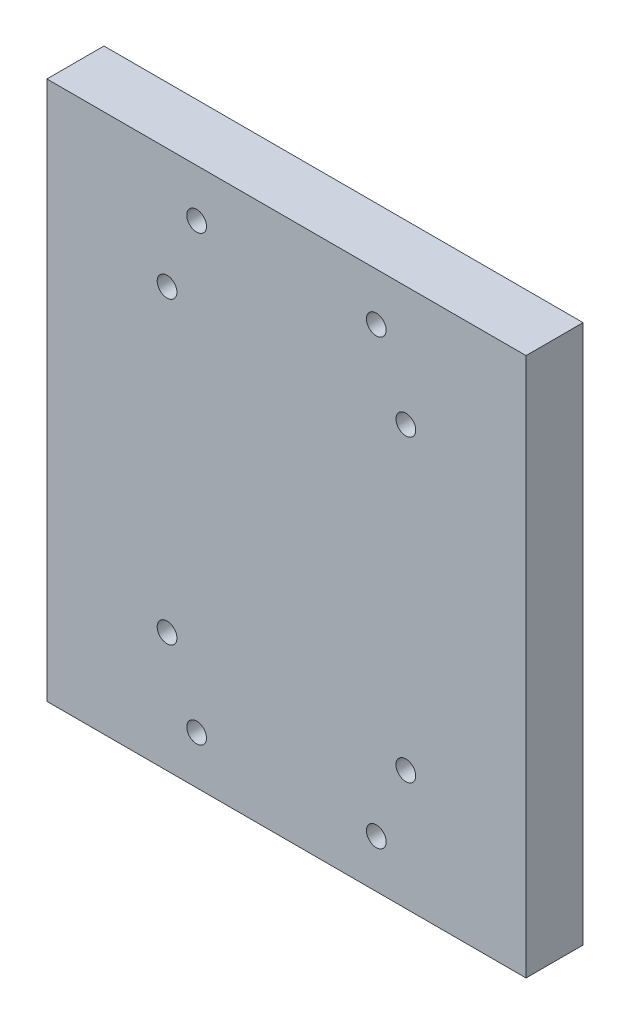
ISO-10303-21;
HEADER;
FILE_DESCRIPTION(('STEP AP214'),'2;1');
FILE_NAME('part.step','',(''),(''),'','','');
FILE_SCHEMA(('AUTOMOTIVE_DESIGN { 1 0 10303 214 1 1 1 1 }'));
ENDSEC;
DATA;
#1=APPLICATION_CONTEXT('core data for automotive mechanical design processes');
#2=APPLICATION_PROTOCOL_DEFINITION('international standard','automotive_design',2000,#1);
#3=PRODUCT_CONTEXT('',#1,'mechanical');
#4=PRODUCT('Part','Part','',(#3));
#5=PRODUCT_RELATED_PRODUCT_CATEGORY('part','',(#4));
#6=PRODUCT_DEFINITION_FORMATION('','',#4);
#7=PRODUCT_DEFINITION_CONTEXT('part definition',#1,'design');
#8=PRODUCT_DEFINITION('design','',#6,#7);
#9=PRODUCT_DEFINITION_SHAPE('','',#8);
#10=(LENGTH_UNIT() NAMED_UNIT(*) SI_UNIT(.MILLI.,.METRE.));
#11=(NAMED_UNIT(*) PLANE_ANGLE_UNIT() SI_UNIT($,.RADIAN.));
#12=(NAMED_UNIT(*) SI_UNIT($,.STERADIAN.) SOLID_ANGLE_UNIT());
#13=UNCERTAINTY_MEASURE_WITH_UNIT(LENGTH_MEASURE(1.E-05),#10,'distance_accuracy_value','');
#14=(GEOMETRIC_REPRESENTATION_CONTEXT(3) GLOBAL_UNCERTAINTY_ASSIGNED_CONTEXT((#13)) GLOBAL_UNIT_ASSIGNED_CONTEXT((#10,
#11,#12)) REPRESENTATION_CONTEXT('',''));
#15=CARTESIAN_POINT('',(0.,0.,0.));
#16=DIRECTION('',(0.,0.,1.));
#17=DIRECTION('',(1.,0.,0.));
#18=AXIS2_PLACEMENT_3D('',#15,#16,#17);
#19=CARTESIAN_POINT('',(0.,90.,9.53));
#20=DIRECTION('',(0.,0.,-1.));
#21=DIRECTION('',(-1.,0.,0.));
#22=AXIS2_PLACEMENT_3D('',#19,#20,#21);
#23=PLANE('',#22);
#24=CARTESIAN_POINT('',(20.065,70.,9.53));
#25=DIRECTION('',(0.,0.,1.));
#26=DIRECTION('',(1.,0.,0.));
#27=AXIS2_PLACEMENT_3D('',#24,#25,#26);
#28=CIRCLE('',#27,1.65);
#29=CARTESIAN_POINT('',(21.715,70.,9.53));
#30=VERTEX_POINT('',#29);
#31=EDGE_CURVE('E132',#30,#30,#28,.T.);
#32=ORIENTED_EDGE('',*,*,#31,.F.);
#33=EDGE_LOOP('',(#32));
#34=FACE_BOUND('',#33,.T.);
#35=CARTESIAN_POINT('',(20.065,20.,9.53));
#36=DIRECTION('',(0.,0.,1.));
#37=DIRECTION('',(1.,0.,0.));
#38=AXIS2_PLACEMENT_3D('',#35,#36,#37);
#39=CIRCLE('',#38,1.65);
#40=CARTESIAN_POINT('',(21.715,20.,9.53));
#41=VERTEX_POINT('',#40);
#42=EDGE_CURVE('E122',#41,#41,#39,.T.);
#43=ORIENTED_EDGE('',*,*,#42,.F.);
#44=EDGE_LOOP('',(#43));
#45=FACE_BOUND('',#44,.T.);
#46=CARTESIAN_POINT('',(59.935,20.,9.53));
#47=DIRECTION('',(0.,0.,1.));
#48=DIRECTION('',(1.,0.,0.));
#49=AXIS2_PLACEMENT_3D('',#46,#47,#48);
#50=CIRCLE('',#49,1.65);
#51=CARTESIAN_POINT('',(61.585,20.,9.53));
#52=VERTEX_POINT('',#51);
#53=EDGE_CURVE('E119',#52,#52,#50,.T.);
#54=ORIENTED_EDGE('',*,*,#53,.F.);
#55=EDGE_LOOP('',(#54));
#56=FACE_BOUND('',#55,.T.);
#57=CARTESIAN_POINT('',(59.935,70.,9.53));
#58=DIRECTION('',(0.,0.,1.));
#59=DIRECTION('',(1.,0.,0.));
#60=AXIS2_PLACEMENT_3D('',#57,#58,#59);
#61=CIRCLE('',#60,1.65);
#62=CARTESIAN_POINT('',(61.585,70.,9.53));
#63=VERTEX_POINT('',#62);
#64=EDGE_CURVE('E116',#63,#63,#61,.T.);
#65=ORIENTED_EDGE('',*,*,#64,.F.);
#66=EDGE_LOOP('',(#65));
#67=FACE_BOUND('',#66,.T.);
#68=CARTESIAN_POINT('',(55.,81.9999999999998,9.53));
#69=DIRECTION('',(0.,0.,1.));
#70=DIRECTION('',(1.,0.,0.));
#71=AXIS2_PLACEMENT_3D('',#68,#69,#70);
#72=CIRCLE('',#71,1.65);
#73=CARTESIAN_POINT('',(56.65,81.9999999999998,9.53));
#74=VERTEX_POINT('',#73);
#75=EDGE_CURVE('E143',#74,#74,#72,.T.);
#76=ORIENTED_EDGE('',*,*,#75,.F.);
#77=EDGE_LOOP('',(#76));
#78=FACE_BOUND('',#77,.T.);
#79=CARTESIAN_POINT('',(55.,8.,9.53));
#80=DIRECTION('',(0.,0.,1.));
#81=DIRECTION('',(1.,0.,0.));
#82=AXIS2_PLACEMENT_3D('',#79,#80,#81);
#83=CIRCLE('',#82,1.65);
#84=CARTESIAN_POINT('',(56.65,8.,9.53));
#85=VERTEX_POINT('',#84);
#86=EDGE_CURVE('E106',#85,#85,#83,.T.);
#87=ORIENTED_EDGE('',*,*,#86,.F.);
#88=EDGE_LOOP('',(#87));
#89=FACE_BOUND('',#88,.T.);
#90=DIRECTION('',(0.,-1.,0.));
#91=VECTOR('',#90,1.);
#92=CARTESIAN_POINT('',(0.,0.,9.53));
#93=LINE('',#92,#91);
#94=CARTESIAN_POINT('',(0.,90.,9.53));
#95=VERTEX_POINT('',#94);
#96=CARTESIAN_POINT('',(0.,0.,9.53));
#97=VERTEX_POINT('',#96);
#98=EDGE_CURVE('E90',#95,#97,#93,.T.);
#99=ORIENTED_EDGE('',*,*,#98,.T.);
#100=DIRECTION('',(1.,0.,0.));
#101=VECTOR('',#100,1.);
#102=CARTESIAN_POINT('',(0.,0.,9.53));
#103=LINE('',#102,#101);
#104=CARTESIAN_POINT('',(80.,0.,9.53));
#105=VERTEX_POINT('',#104);
#106=EDGE_CURVE('E85',#97,#105,#103,.T.);
#107=ORIENTED_EDGE('',*,*,#106,.T.);
#108=DIRECTION('',(0.,1.,0.));
#109=VECTOR('',#108,1.);
#110=CARTESIAN_POINT('',(80.,0.,9.53));
#111=LINE('',#110,#109);
#112=CARTESIAN_POINT('',(80.,90.,9.53));
#113=VERTEX_POINT('',#112);
#114=EDGE_CURVE('E88',#105,#113,#111,.T.);
#115=ORIENTED_EDGE('',*,*,#114,.T.);
#116=DIRECTION('',(-1.,0.,0.));
#117=VECTOR('',#116,1.);
#118=CARTESIAN_POINT('',(0.,90.,9.53));
#119=LINE('',#118,#117);
#120=EDGE_CURVE('E55',#113,#95,#119,.T.);
#121=ORIENTED_EDGE('',*,*,#120,.T.);
#122=EDGE_LOOP('',(#99,#107,#115,#121));
#123=FACE_BOUND('',#122,.T.);
#124=CARTESIAN_POINT('',(25.,8.,9.53));
#125=DIRECTION('',(0.,0.,1.));
#126=DIRECTION('',(1.,0.,0.));
#127=AXIS2_PLACEMENT_3D('',#124,#125,#126);
#128=CIRCLE('',#127,1.65);
#129=CARTESIAN_POINT('',(26.65,8.,9.53));
#130=VERTEX_POINT('',#129);
#131=EDGE_CURVE('E149',#130,#130,#128,.T.);
#132=ORIENTED_EDGE('',*,*,#131,.F.);
#133=EDGE_LOOP('',(#132));
#134=FACE_BOUND('',#133,.T.);
#135=CARTESIAN_POINT('',(25.,81.9999999999998,9.53));
#136=DIRECTION('',(0.,0.,1.));
#137=DIRECTION('',(1.,0.,0.));
#138=AXIS2_PLACEMENT_3D('',#135,#136,#137);
#139=CIRCLE('',#138,1.65);
#140=CARTESIAN_POINT('',(26.65,81.9999999999998,9.53));
#141=VERTEX_POINT('',#140);
#142=EDGE_CURVE('E137',#141,#141,#139,.T.);
#143=ORIENTED_EDGE('',*,*,#142,.F.);
#144=EDGE_LOOP('',(#143));
#145=FACE_BOUND('',#144,.T.);
#146=ADVANCED_FACE('F36',(#34,#45,#56,#67,#78,#89,#123,#134,#145),#23,.F.);
#147=CARTESIAN_POINT('',(0.,90.,0.));
#148=DIRECTION('',(0.,0.,-1.));
#149=DIRECTION('',(-1.,0.,0.));
#150=AXIS2_PLACEMENT_3D('',#147,#148,#149);
#151=PLANE('',#150);
#152=CARTESIAN_POINT('',(20.065,70.,0.));
#153=DIRECTION('',(0.,0.,-1.));
#154=DIRECTION('',(-1.,0.,0.));
#155=AXIS2_PLACEMENT_3D('',#152,#153,#154);
#156=CIRCLE('',#155,1.65);
#157=CARTESIAN_POINT('',(18.415,70.,0.));
#158=VERTEX_POINT('',#157);
#159=EDGE_CURVE('E40',#158,#158,#156,.T.);
#160=ORIENTED_EDGE('',*,*,#159,.F.);
#161=EDGE_LOOP('',(#160));
#162=FACE_BOUND('',#161,.T.);
#163=CARTESIAN_POINT('',(20.065,20.,0.));
#164=DIRECTION('',(0.,0.,-1.));
#165=DIRECTION('',(-1.,0.,0.));
#166=AXIS2_PLACEMENT_3D('',#163,#164,#165);
#167=CIRCLE('',#166,1.65);
#168=CARTESIAN_POINT('',(18.415,20.,0.));
#169=VERTEX_POINT('',#168);
#170=EDGE_CURVE('E120',#169,#169,#167,.T.);
#171=ORIENTED_EDGE('',*,*,#170,.F.);
#172=EDGE_LOOP('',(#171));
#173=FACE_BOUND('',#172,.T.);
#174=CARTESIAN_POINT('',(59.935,20.,0.));
#175=DIRECTION('',(0.,0.,-1.));
#176=DIRECTION('',(-1.,0.,0.));
#177=AXIS2_PLACEMENT_3D('',#174,#175,#176);
#178=CIRCLE('',#177,1.65);
#179=CARTESIAN_POINT('',(58.285,20.,0.));
#180=VERTEX_POINT('',#179);
#181=EDGE_CURVE('E117',#180,#180,#178,.T.);
#182=ORIENTED_EDGE('',*,*,#181,.F.);
#183=EDGE_LOOP('',(#182));
#184=FACE_BOUND('',#183,.T.);
#185=CARTESIAN_POINT('',(59.935,70.,0.));
#186=DIRECTION('',(0.,0.,-1.));
#187=DIRECTION('',(-1.,0.,0.));
#188=AXIS2_PLACEMENT_3D('',#185,#186,#187);
#189=CIRCLE('',#188,1.65);
#190=CARTESIAN_POINT('',(58.285,70.,0.));
#191=VERTEX_POINT('',#190);
#192=EDGE_CURVE('E112',#191,#191,#189,.T.);
#193=ORIENTED_EDGE('',*,*,#192,.F.);
#194=EDGE_LOOP('',(#193));
#195=FACE_BOUND('',#194,.T.);
#196=CARTESIAN_POINT('',(55.,81.9999999999998,0.));
#197=DIRECTION('',(0.,0.,1.));
#198=DIRECTION('',(1.,0.,0.));
#199=AXIS2_PLACEMENT_3D('',#196,#197,#198);
#200=CIRCLE('',#199,1.65);
#201=CARTESIAN_POINT('',(56.65,81.9999999999998,0.));
#202=VERTEX_POINT('',#201);
#203=EDGE_CURVE('E140',#202,#202,#200,.T.);
#204=ORIENTED_EDGE('',*,*,#203,.T.);
#205=EDGE_LOOP('',(#204));
#206=FACE_BOUND('',#205,.T.);
#207=CARTESIAN_POINT('',(55.,8.,0.));
#208=DIRECTION('',(0.,0.,1.));
#209=DIRECTION('',(1.,0.,0.));
#210=AXIS2_PLACEMENT_3D('',#207,#208,#209);
#211=CIRCLE('',#210,1.65);
#212=CARTESIAN_POINT('',(56.65,8.,0.));
#213=VERTEX_POINT('',#212);
#214=EDGE_CURVE('E152',#213,#213,#211,.T.);
#215=ORIENTED_EDGE('',*,*,#214,.T.);
#216=EDGE_LOOP('',(#215));
#217=FACE_BOUND('',#216,.T.);
#218=DIRECTION('',(0.,-1.,0.));
#219=VECTOR('',#218,1.);
#220=CARTESIAN_POINT('',(0.,0.,0.));
#221=LINE('',#220,#219);
#222=CARTESIAN_POINT('',(0.,90.,0.));
#223=VERTEX_POINT('',#222);
#224=CARTESIAN_POINT('',(0.,0.,0.));
#225=VERTEX_POINT('',#224);
#226=EDGE_CURVE('E103',#223,#225,#221,.T.);
#227=ORIENTED_EDGE('',*,*,#226,.F.);
#228=DIRECTION('',(-1.,0.,0.));
#229=VECTOR('',#228,1.);
#230=CARTESIAN_POINT('',(0.,90.,0.));
#231=LINE('',#230,#229);
#232=CARTESIAN_POINT('',(80.,90.,0.));
#233=VERTEX_POINT('',#232);
#234=EDGE_CURVE('E78',#233,#223,#231,.T.);
#235=ORIENTED_EDGE('',*,*,#234,.F.);
#236=DIRECTION('',(0.,1.,0.));
#237=VECTOR('',#236,1.);
#238=CARTESIAN_POINT('',(80.,0.,0.));
#239=LINE('',#238,#237);
#240=CARTESIAN_POINT('',(80.,0.,0.));
#241=VERTEX_POINT('',#240);
#242=EDGE_CURVE('E72',#241,#233,#239,.T.);
#243=ORIENTED_EDGE('',*,*,#242,.F.);
#244=DIRECTION('',(1.,0.,0.));
#245=VECTOR('',#244,1.);
#246=CARTESIAN_POINT('',(0.,0.,0.));
#247=LINE('',#246,#245);
#248=EDGE_CURVE('E94',#225,#241,#247,.T.);
#249=ORIENTED_EDGE('',*,*,#248,.F.);
#250=EDGE_LOOP('',(#227,#235,#243,#249));
#251=FACE_BOUND('',#250,.T.);
#252=CARTESIAN_POINT('',(25.,8.,0.));
#253=DIRECTION('',(0.,0.,1.));
#254=DIRECTION('',(1.,0.,0.));
#255=AXIS2_PLACEMENT_3D('',#252,#253,#254);
#256=CIRCLE('',#255,1.65);
#257=CARTESIAN_POINT('',(26.65,8.,0.));
#258=VERTEX_POINT('',#257);
#259=EDGE_CURVE('E146',#258,#258,#256,.T.);
#260=ORIENTED_EDGE('',*,*,#259,.T.);
#261=EDGE_LOOP('',(#260));
#262=FACE_BOUND('',#261,.T.);
#263=CARTESIAN_POINT('',(25.,81.9999999999998,0.));
#264=DIRECTION('',(0.,0.,1.));
#265=DIRECTION('',(1.,0.,0.));
#266=AXIS2_PLACEMENT_3D('',#263,#264,#265);
#267=CIRCLE('',#266,1.65);
#268=CARTESIAN_POINT('',(26.65,81.9999999999998,0.));
#269=VERTEX_POINT('',#268);
#270=EDGE_CURVE('E115',#269,#269,#267,.T.);
#271=ORIENTED_EDGE('',*,*,#270,.T.);
#272=EDGE_LOOP('',(#271));
#273=FACE_BOUND('',#272,.T.);
#274=ADVANCED_FACE('F160',(#162,#173,#184,#195,#206,#217,#251,#262,#273),#151,.T.);
#275=CARTESIAN_POINT('',(0.,0.,9.53));
#276=DIRECTION('',(1.,0.,0.));
#277=DIRECTION('',(0.,0.,-1.));
#278=AXIS2_PLACEMENT_3D('',#275,#276,#277);
#279=PLANE('',#278);
#280=ORIENTED_EDGE('',*,*,#226,.T.);
#281=DIRECTION('',(0.,0.,-1.));
#282=VECTOR('',#281,1.);
#283=CARTESIAN_POINT('',(0.,0.,9.53));
#284=LINE('',#283,#282);
#285=EDGE_CURVE('E11',#97,#225,#284,.T.);
#286=ORIENTED_EDGE('',*,*,#285,.F.);
#287=ORIENTED_EDGE('',*,*,#98,.F.);
#288=DIRECTION('',(0.,0.,-1.));
#289=VECTOR('',#288,1.);
#290=CARTESIAN_POINT('',(0.,90.,9.53));
#291=LINE('',#290,#289);
#292=EDGE_CURVE('E99',#95,#223,#291,.T.);
#293=ORIENTED_EDGE('',*,*,#292,.T.);
#294=EDGE_LOOP('',(#280,#286,#287,#293));
#295=FACE_BOUND('',#294,.T.);
#296=ADVANCED_FACE('F38',(#295),#279,.F.);
#297=CARTESIAN_POINT('',(0.,0.,9.53));
#298=DIRECTION('',(0.,1.,0.));
#299=DIRECTION('',(0.,0.,1.));
#300=AXIS2_PLACEMENT_3D('',#297,#298,#299);
#301=PLANE('',#300);
#302=ORIENTED_EDGE('',*,*,#248,.T.);
#303=DIRECTION('',(0.,0.,-1.));
#304=VECTOR('',#303,1.);
#305=CARTESIAN_POINT('',(80.,0.,9.53));
#306=LINE('',#305,#304);
#307=EDGE_CURVE('E46',#105,#241,#306,.T.);
#308=ORIENTED_EDGE('',*,*,#307,.F.);
#309=ORIENTED_EDGE('',*,*,#106,.F.);
#310=ORIENTED_EDGE('',*,*,#285,.T.);
#311=EDGE_LOOP('',(#302,#308,#309,#310));
#312=FACE_BOUND('',#311,.T.);
#313=ADVANCED_FACE('F93',(#312),#301,.F.);
#314=CARTESIAN_POINT('',(80.,0.,9.53));
#315=DIRECTION('',(-1.,0.,0.));
#316=DIRECTION('',(0.,0.,1.));
#317=AXIS2_PLACEMENT_3D('',#314,#315,#316);
#318=PLANE('',#317);
#319=ORIENTED_EDGE('',*,*,#242,.T.);
#320=DIRECTION('',(0.,0.,-1.));
#321=VECTOR('',#320,1.);
#322=CARTESIAN_POINT('',(80.,90.,9.53));
#323=LINE('',#322,#321);
#324=EDGE_CURVE('E95',#113,#233,#323,.T.);
#325=ORIENTED_EDGE('',*,*,#324,.F.);
#326=ORIENTED_EDGE('',*,*,#114,.F.);
#327=ORIENTED_EDGE('',*,*,#307,.T.);
#328=EDGE_LOOP('',(#319,#325,#326,#327));
#329=FACE_BOUND('',#328,.T.);
#330=ADVANCED_FACE('F97',(#329),#318,.F.);
#331=CARTESIAN_POINT('',(0.,90.,9.53));
#332=DIRECTION('',(0.,-1.,0.));
#333=DIRECTION('',(0.,0.,-1.));
#334=AXIS2_PLACEMENT_3D('',#331,#332,#333);
#335=PLANE('',#334);
#336=ORIENTED_EDGE('',*,*,#234,.T.);
#337=ORIENTED_EDGE('',*,*,#292,.F.);
#338=ORIENTED_EDGE('',*,*,#120,.F.);
#339=ORIENTED_EDGE('',*,*,#324,.T.);
#340=EDGE_LOOP('',(#336,#337,#338,#339));
#341=FACE_BOUND('',#340,.T.);
#342=ADVANCED_FACE('F166',(#341),#335,.F.);
#343=CARTESIAN_POINT('',(55.,8.,9.53));
#344=DIRECTION('',(0.,0.,-1.));
#345=DIRECTION('',(-1.,0.,0.));
#346=AXIS2_PLACEMENT_3D('',#343,#344,#345);
#347=CYLINDRICAL_SURFACE('',#346,1.65);
#348=ORIENTED_EDGE('',*,*,#86,.T.);
#349=EDGE_LOOP('',(#348));
#350=FACE_BOUND('',#349,.T.);
#351=ORIENTED_EDGE('',*,*,#214,.F.);
#352=EDGE_LOOP('',(#351));
#353=FACE_BOUND('',#352,.T.);
#354=ADVANCED_FACE('F163',(#350,#353),#347,.F.);
#355=CARTESIAN_POINT('',(25.,8.,9.53));
#356=DIRECTION('',(0.,0.,-1.));
#357=DIRECTION('',(-1.,0.,0.));
#358=AXIS2_PLACEMENT_3D('',#355,#356,#357);
#359=CYLINDRICAL_SURFACE('',#358,1.65);
#360=ORIENTED_EDGE('',*,*,#131,.T.);
#361=EDGE_LOOP('',(#360));
#362=FACE_BOUND('',#361,.T.);
#363=ORIENTED_EDGE('',*,*,#259,.F.);
#364=EDGE_LOOP('',(#363));
#365=FACE_BOUND('',#364,.T.);
#366=ADVANCED_FACE('F165',(#362,#365),#359,.F.);
#367=CARTESIAN_POINT('',(55.,81.9999999999998,9.53));
#368=DIRECTION('',(0.,0.,-1.));
#369=DIRECTION('',(-1.,0.,0.));
#370=AXIS2_PLACEMENT_3D('',#367,#368,#369);
#371=CYLINDRICAL_SURFACE('',#370,1.65);
#372=ORIENTED_EDGE('',*,*,#75,.T.);
#373=EDGE_LOOP('',(#372));
#374=FACE_BOUND('',#373,.T.);
#375=ORIENTED_EDGE('',*,*,#203,.F.);
#376=EDGE_LOOP('',(#375));
#377=FACE_BOUND('',#376,.T.);
#378=ADVANCED_FACE('F173',(#374,#377),#371,.F.);
#379=CARTESIAN_POINT('',(25.,81.9999999999998,9.53));
#380=DIRECTION('',(0.,0.,-1.));
#381=DIRECTION('',(-1.,0.,0.));
#382=AXIS2_PLACEMENT_3D('',#379,#380,#381);
#383=CYLINDRICAL_SURFACE('',#382,1.65);
#384=ORIENTED_EDGE('',*,*,#142,.T.);
#385=EDGE_LOOP('',(#384));
#386=FACE_BOUND('',#385,.T.);
#387=ORIENTED_EDGE('',*,*,#270,.F.);
#388=EDGE_LOOP('',(#387));
#389=FACE_BOUND('',#388,.T.);
#390=ADVANCED_FACE('F204',(#386,#389),#383,.F.);
#391=CARTESIAN_POINT('',(59.935,70.,9.53));
#392=DIRECTION('',(0.,0.,1.));
#393=DIRECTION('',(1.,0.,0.));
#394=AXIS2_PLACEMENT_3D('',#391,#392,#393);
#395=CYLINDRICAL_SURFACE('',#394,1.65);
#396=ORIENTED_EDGE('',*,*,#192,.T.);
#397=EDGE_LOOP('',(#396));
#398=FACE_BOUND('',#397,.T.);
#399=ORIENTED_EDGE('',*,*,#64,.T.);
#400=EDGE_LOOP('',(#399));
#401=FACE_BOUND('',#400,.T.);
#402=ADVANCED_FACE('F206',(#398,#401),#395,.F.);
#403=CARTESIAN_POINT('',(59.935,20.,9.53));
#404=DIRECTION('',(0.,0.,1.));
#405=DIRECTION('',(1.,0.,0.));
#406=AXIS2_PLACEMENT_3D('',#403,#404,#405);
#407=CYLINDRICAL_SURFACE('',#406,1.65);
#408=ORIENTED_EDGE('',*,*,#181,.T.);
#409=EDGE_LOOP('',(#408));
#410=FACE_BOUND('',#409,.T.);
#411=ORIENTED_EDGE('',*,*,#53,.T.);
#412=EDGE_LOOP('',(#411));
#413=FACE_BOUND('',#412,.T.);
#414=ADVANCED_FACE('F212',(#410,#413),#407,.F.);
#415=CARTESIAN_POINT('',(20.065,20.,9.53));
#416=DIRECTION('',(0.,0.,1.));
#417=DIRECTION('',(1.,0.,0.));
#418=AXIS2_PLACEMENT_3D('',#415,#416,#417);
#419=CYLINDRICAL_SURFACE('',#418,1.65);
#420=ORIENTED_EDGE('',*,*,#170,.T.);
#421=EDGE_LOOP('',(#420));
#422=FACE_BOUND('',#421,.T.);
#423=ORIENTED_EDGE('',*,*,#42,.T.);
#424=EDGE_LOOP('',(#423));
#425=FACE_BOUND('',#424,.T.);
#426=ADVANCED_FACE('F220',(#422,#425),#419,.F.);
#427=CARTESIAN_POINT('',(20.065,70.,9.53));
#428=DIRECTION('',(0.,0.,1.));
#429=DIRECTION('',(1.,0.,0.));
#430=AXIS2_PLACEMENT_3D('',#427,#428,#429);
#431=CYLINDRICAL_SURFACE('',#430,1.65);
#432=ORIENTED_EDGE('',*,*,#159,.T.);
#433=EDGE_LOOP('',(#432));
#434=FACE_BOUND('',#433,.T.);
#435=ORIENTED_EDGE('',*,*,#31,.T.);
#436=EDGE_LOOP('',(#435));
#437=FACE_BOUND('',#436,.T.);
#438=ADVANCED_FACE('F224',(#434,#437),#431,.F.);
#439=CLOSED_SHELL('',(#146,#274,#296,#313,#330,#342,#354,#366,#378,#390,#402,#414,#426,#438));
#440=MANIFOLD_SOLID_BREP('B2',#439);
#441=ADVANCED_BREP_SHAPE_REPRESENTATION('',(#18,#440),#14);
#442=SHAPE_DEFINITION_REPRESENTATION(#9,#441);
ENDSEC;
END-ISO-10303-21;
